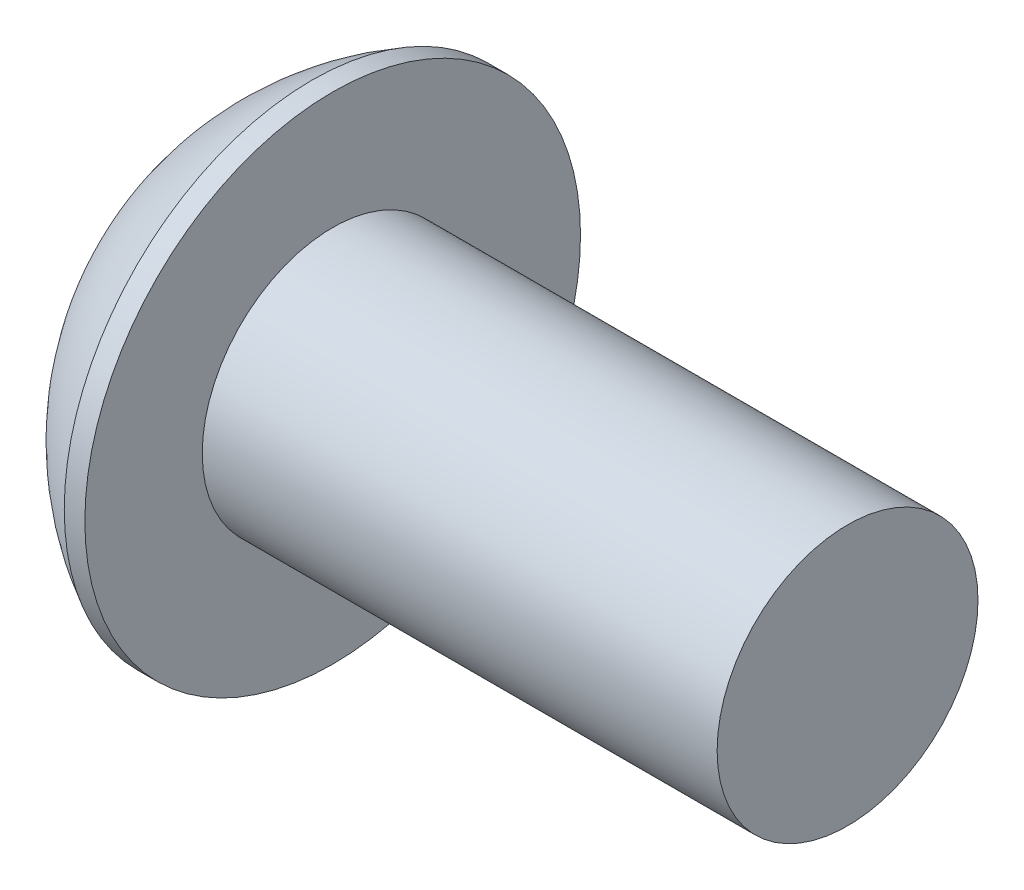
ISO-10303-21;
HEADER;
FILE_DESCRIPTION(('STEP AP214'),'2;1');
FILE_NAME('part.step','',(''),(''),'','','');
FILE_SCHEMA(('AUTOMOTIVE_DESIGN { 1 0 10303 214 1 1 1 1 }'));
ENDSEC;
DATA;
#1=APPLICATION_CONTEXT('core data for automotive mechanical design processes');
#2=APPLICATION_PROTOCOL_DEFINITION('international standard','automotive_design',2000,#1);
#3=PRODUCT_CONTEXT('',#1,'mechanical');
#4=PRODUCT('Part','Part','',(#3));
#5=PRODUCT_RELATED_PRODUCT_CATEGORY('part','',(#4));
#6=PRODUCT_DEFINITION_FORMATION('','',#4);
#7=PRODUCT_DEFINITION_CONTEXT('part definition',#1,'design');
#8=PRODUCT_DEFINITION('design','',#6,#7);
#9=PRODUCT_DEFINITION_SHAPE('','',#8);
#10=(LENGTH_UNIT() NAMED_UNIT(*) SI_UNIT(.MILLI.,.METRE.));
#11=(NAMED_UNIT(*) PLANE_ANGLE_UNIT() SI_UNIT($,.RADIAN.));
#12=(NAMED_UNIT(*) SI_UNIT($,.STERADIAN.) SOLID_ANGLE_UNIT());
#13=UNCERTAINTY_MEASURE_WITH_UNIT(LENGTH_MEASURE(1.E-05),#10,'distance_accuracy_value','');
#14=(GEOMETRIC_REPRESENTATION_CONTEXT(3) GLOBAL_UNCERTAINTY_ASSIGNED_CONTEXT((#13)) GLOBAL_UNIT_ASSIGNED_CONTEXT((#10,
#11,#12)) REPRESENTATION_CONTEXT('',''));
#15=CARTESIAN_POINT('',(0.,0.,0.));
#16=DIRECTION('',(0.,0.,1.));
#17=DIRECTION('',(1.,0.,0.));
#18=AXIS2_PLACEMENT_3D('',#15,#16,#17);
#19=CARTESIAN_POINT('',(-1.82880000000001,0.,0.));
#20=DIRECTION('',(-1.,0.,0.));
#21=DIRECTION('',(0.,0.,-1.));
#22=AXIS2_PLACEMENT_3D('',#19,#20,#21);
#23=CONICAL_SURFACE('',#22,1.8288,0.785398163397446);
#24=CARTESIAN_POINT('',(-1.82880000000001,0.,0.));
#25=DIRECTION('',(1.,0.,0.));
#26=DIRECTION('',(0.,0.,-1.));
#27=AXIS2_PLACEMENT_3D('',#24,#25,#26);
#28=CIRCLE('',#27,1.8288);
#29=CARTESIAN_POINT('',(-1.82880000000001,-1.5800482210968,-0.920845838894232));
#30=VERTEX_POINT('',#29);
#31=CARTESIAN_POINT('',(-1.82880000000001,-0.00745177890319596,-1.82878481812136));
#32=VERTEX_POINT('',#31);
#33=EDGE_CURVE('E237',#30,#32,#28,.T.);
#34=ORIENTED_EDGE('',*,*,#33,.F.);
#35=CARTESIAN_POINT('',(-1.82900000000001,-0.00710296193273566,-1.82898620769315));
#36=CARTESIAN_POINT('',(-1.79798176582111,-0.0612413968680569,-1.79772936770974));
#37=CARTESIAN_POINT('',(-1.768804762154,-0.116280715119974,-1.76595240250098));
#38=CARTESIAN_POINT('',(-1.71541731135211,-0.228486753173014,-1.70117021622636));
#39=CARTESIAN_POINT('',(-1.6912359800132,-0.285663770827651,-1.66815904969199));
#40=CARTESIAN_POINT('',(-1.64983313923053,-0.400953626097391,-1.60159642071718));
#41=CARTESIAN_POINT('',(-1.63250927558265,-0.459038096623038,-1.56806133602346));
#42=CARTESIAN_POINT('',(-1.60583796244815,-0.57646465769773,-1.50026507937697));
#43=CARTESIAN_POINT('',(-1.59647107247955,-0.635803317985223,-1.46600588788664));
#44=CARTESIAN_POINT('',(-1.58800887531627,-0.738427717920978,-1.4067556629583));
#45=CARTESIAN_POINT('',(-1.58678086812113,-0.781586520417756,-1.38183791671889));
#46=CARTESIAN_POINT('',(-1.58902398395721,-0.86782949219464,-1.33204551374779));
#47=CARTESIAN_POINT('',(-1.59249673611106,-0.910913630416431,-1.30717087494764));
#48=CARTESIAN_POINT('',(-1.60394206540771,-0.996659819496217,-1.25766528960044));
#49=CARTESIAN_POINT('',(-1.61191838302761,-1.0393214894606,-1.23303456296242));
#50=CARTESIAN_POINT('',(-1.63193840774461,-1.12392707655171,-1.18418750448042));
#51=CARTESIAN_POINT('',(-1.6439838418413,-1.1658706809649,-1.15997135318168));
#52=CARTESIAN_POINT('',(-1.67924043571692,-1.27185330769289,-1.09878225511085));
#53=CARTESIAN_POINT('',(-1.70494165955475,-1.33527334252756,-1.06216668092704));
#54=CARTESIAN_POINT('',(-1.74825503670668,-1.42856416830639,-1.00830519755071));
#55=CARTESIAN_POINT('',(-1.76346130507454,-1.45931193774139,-0.990552964590434));
#56=CARTESIAN_POINT('',(-1.79524996181871,-1.52025510962339,-0.955367407899095));
#57=CARTESIAN_POINT('',(-1.8118317729839,-1.55045073733563,-0.937933954111084));
#58=CARTESIAN_POINT('',(-1.82900000000027,-1.58039703806773,-0.920644449322172));
#59=B_SPLINE_CURVE_WITH_KNOTS('',3,(#35,#36,#37,#38,#39,#40,#41,#42,#43,#44,#45,#46,#47,#48,#49,
#50,#51,#52,#53,#54,#55,#56,#57,#58),.UNSPECIFIED.,.F.,.F.,(4,2,2,2,2,2,2,2,2,2,2,4),(0.,
0.209500144466995,0.420188843332821,0.627602144749848,0.834507224341981,0.983847288144539,
1.13323912136536,1.28275521623455,1.43233484807212,1.66469982490852,1.78055165650198,
1.89635511741463),.UNSPECIFIED.);
#60=EDGE_CURVE('E207',#32,#30,#59,.T.);
#61=ORIENTED_EDGE('',*,*,#60,.F.);
#62=EDGE_LOOP('',(#34,#61));
#63=FACE_BOUND('',#62,.T.);
#64=ADVANCED_FACE('F43',(#63),#23,.F.);
#65=CARTESIAN_POINT('',(-1.82880000000001,-1.5875,0.907938979227127));
#66=VERTEX_POINT('',#65);
#67=CARTESIAN_POINT('',(-1.82880000000001,-1.5875,-0.907938979227127));
#68=VERTEX_POINT('',#67);
#69=EDGE_CURVE('E270',#66,#68,#28,.T.);
#70=ORIENTED_EDGE('',*,*,#69,.F.);
#71=CARTESIAN_POINT('',(-2.41884583359235,-1.5875,1.82500929221937));
#72=CARTESIAN_POINT('',(-2.38531276542623,-1.5875,1.78055818469936));
#73=CARTESIAN_POINT('',(-2.35210936835997,-1.5875,1.73585907650942));
#74=CARTESIAN_POINT('',(-2.28649794756445,-1.5875,1.64586427633954));
#75=CARTESIAN_POINT('',(-2.25409012601858,-1.5875,1.600568437113));
#76=CARTESIAN_POINT('',(-2.15780190494498,-1.5875,1.46297210215584));
#77=CARTESIAN_POINT('',(-2.09537319757193,-1.5875,1.36963858857972));
#78=CARTESIAN_POINT('',(-1.97284516161749,-1.5875,1.1739408617932));
#79=CARTESIAN_POINT('',(-1.91308014332863,-1.5875,1.07136492019386));
#80=CARTESIAN_POINT('',(-1.80377603992626,-1.5875,0.861093370178889));
#81=CARTESIAN_POINT('',(-1.75420248563308,-1.5875,0.753416586787839));
#82=CARTESIAN_POINT('',(-1.69355473541147,-1.5875,0.59176442890705));
#83=CARTESIAN_POINT('',(-1.67614346878425,-1.5875,0.540176081947481));
#84=CARTESIAN_POINT('',(-1.64546298974417,-1.5875,0.435756532214797));
#85=CARTESIAN_POINT('',(-1.63219406350996,-1.5875,0.382925243842576));
#86=CARTESIAN_POINT('',(-1.61070764570342,-1.5875,0.277216790300937));
#87=CARTESIAN_POINT('',(-1.60240378593419,-1.5875,0.224357458354004));
#88=CARTESIAN_POINT('',(-1.59100915058537,-1.5875,0.118076745851791));
#89=CARTESIAN_POINT('',(-1.58791748493136,-1.5875,0.0646554628277625));
#90=CARTESIAN_POINT('',(-1.58717534074502,-1.5875,-0.0403024254508758));
#91=CARTESIAN_POINT('',(-1.58933324549264,-1.5875,-0.0918377424270171));
#92=CARTESIAN_POINT('',(-1.59854919060368,-1.5875,-0.194465290551352));
#93=CARTESIAN_POINT('',(-1.60560770796995,-1.5875,-0.245557478077194));
#94=CARTESIAN_POINT('',(-1.62435975757509,-1.5875,-0.347793759019247));
#95=CARTESIAN_POINT('',(-1.63613206364932,-1.5875,-0.398923183857681));
#96=CARTESIAN_POINT('',(-1.66368690090293,-1.5875,-0.500065247928145));
#97=CARTESIAN_POINT('',(-1.67946909288466,-1.5875,-0.55007798123241));
#98=CARTESIAN_POINT('',(-1.73513369416259,-1.5875,-0.707672888264434));
#99=CARTESIAN_POINT('',(-1.78136125535134,-1.5875,-0.813008430509164));
#100=CARTESIAN_POINT('',(-1.88413869504212,-1.5875,-1.01872985181378));
#101=CARTESIAN_POINT('',(-1.94072568595621,-1.5875,-1.11909623158763));
#102=CARTESIAN_POINT('',(-2.05746539148359,-1.5875,-1.31090882483437));
#103=CARTESIAN_POINT('',(-2.11730100937777,-1.5875,-1.40255044446812));
#104=CARTESIAN_POINT('',(-2.20979890181475,-1.5875,-1.53756602680819));
#105=CARTESIAN_POINT('',(-2.24095734379018,-1.5875,-1.58198845986807));
#106=CARTESIAN_POINT('',(-2.30409778175578,-1.5875,-1.67022633905771));
#107=CARTESIAN_POINT('',(-2.33607954894282,-1.5875,-1.71404194872823));
#108=CARTESIAN_POINT('',(-2.36840270150048,-1.5875,-1.75760493469799));
#109=B_SPLINE_CURVE_WITH_KNOTS('',3,(#71,#72,#73,#74,#75,#76,#77,#78,#79,#80,#81,#82,#83,#84,
#85,#86,#87,#88,#89,#90,#91,#92,#93,#94,#95,#96,#97,#98,#99,#100,#101,#102,#103,#104,#105,#106,
#107,#108),.UNSPECIFIED.,.F.,.F.,(4,2,2,2,2,2,2,2,2,2,2,2,2,2,2,2,2,2,4),(0.,0.167038582206583,
0.33411918424497,0.670830460170841,1.0266880706705,1.38132155981881,1.54452529826255,
1.70774030934245,1.86802667313751,2.02828566242478,2.18278328824719,2.33729595425851,
2.49450635071892,2.65170345312208,2.99578906555957,3.34113237629954,3.66930816833921,
3.8320834275226,3.99481392942941),.UNSPECIFIED.);
#110=EDGE_CURVE('E216',#68,#66,#109,.F.);
#111=ORIENTED_EDGE('',*,*,#110,.F.);
#112=EDGE_LOOP('',(#70,#111));
#113=FACE_BOUND('',#112,.T.);
#114=ADVANCED_FACE('F282',(#113),#23,.F.);
#115=CARTESIAN_POINT('',(-1.82880000000001,-0.00745177890319589,1.82878481812136));
#116=VERTEX_POINT('',#115);
#117=CARTESIAN_POINT('',(-1.82880000000001,-1.5800482210968,0.920845838894232));
#118=VERTEX_POINT('',#117);
#119=EDGE_CURVE('E263',#116,#118,#28,.T.);
#120=ORIENTED_EDGE('',*,*,#119,.F.);
#121=CARTESIAN_POINT('',(-1.82900000000027,-1.58039703806773,0.920644449322172));
#122=CARTESIAN_POINT('',(-1.79798176582135,-1.52625860313238,0.9519012893056));
#123=CARTESIAN_POINT('',(-1.76880476215421,-1.47121928488044,0.983678254514374));
#124=CARTESIAN_POINT('',(-1.71541731135227,-1.35901324682734,1.04846044078903));
#125=CARTESIAN_POINT('',(-1.69123598001333,-1.30183622917267,1.08147160732341));
#126=CARTESIAN_POINT('',(-1.64983313923061,-1.18654637390287,1.14803423629827));
#127=CARTESIAN_POINT('',(-1.63250927558271,-1.12846190337719,1.181569320992));
#128=CARTESIAN_POINT('',(-1.60583796244818,-1.01103534230243,1.24936557763853));
#129=CARTESIAN_POINT('',(-1.59647107247956,-0.951696682014902,1.28362476912888));
#130=CARTESIAN_POINT('',(-1.58800887531627,-0.849072282079111,1.34287499405724));
#131=CARTESIAN_POINT('',(-1.58678086812113,-0.805913479582331,1.36779274029665));
#132=CARTESIAN_POINT('',(-1.58902398395721,-0.719670507805444,1.41758514326775));
#133=CARTESIAN_POINT('',(-1.59249673611105,-0.676586369583651,1.44245978206791));
#134=CARTESIAN_POINT('',(-1.6039420654077,-0.590840180503862,1.49196536741511));
#135=CARTESIAN_POINT('',(-1.6119183830276,-0.548178510539481,1.51659609405312));
#136=CARTESIAN_POINT('',(-1.63193840774459,-0.463572923448363,1.56544315253513));
#137=CARTESIAN_POINT('',(-1.64398384184128,-0.421629319035169,1.58965930383387));
#138=CARTESIAN_POINT('',(-1.67924043571687,-0.315646692307251,1.65084840190466));
#139=CARTESIAN_POINT('',(-1.70494165955467,-0.252226657472647,1.68746397608843));
#140=CARTESIAN_POINT('',(-1.74825503670653,-0.158935831693913,1.7413254594647));
#141=CARTESIAN_POINT('',(-1.76346130507437,-0.128188062258947,1.75907769242496));
#142=CARTESIAN_POINT('',(-1.79524996181849,-0.0672448903770153,1.79426324911627));
#143=CARTESIAN_POINT('',(-1.81183177298366,-0.0370492626648079,1.81169670290426));
#144=CARTESIAN_POINT('',(-1.82900000000001,-0.00710296193273622,1.82898620769315));
#145=B_SPLINE_CURVE_WITH_KNOTS('',3,(#121,#122,#123,#124,#125,#126,#127,#128,#129,#130,#131,
#132,#133,#134,#135,#136,#137,#138,#139,#140,#141,#142,#143,#144),.UNSPECIFIED.,.F.,.F.,(4,2,2,
2,2,2,2,2,2,2,2,4),(0.,0.209500144467116,0.420188843333066,0.627602144750217,0.834507224342473,
0.983847288145037,1.13323912136586,1.28275521623506,1.43233484807263,1.66469982490877,
1.78055165650211,1.89635511741463),.UNSPECIFIED.);
#146=EDGE_CURVE('E255',#118,#116,#145,.T.);
#147=ORIENTED_EDGE('',*,*,#146,.F.);
#148=EDGE_LOOP('',(#120,#147));
#149=FACE_BOUND('',#148,.T.);
#150=ADVANCED_FACE('F262',(#149),#23,.F.);
#151=CARTESIAN_POINT('',(-1.82880000000001,1.5800482210968,0.920845838894233));
#152=VERTEX_POINT('',#151);
#153=CARTESIAN_POINT('',(-1.82880000000001,0.00745177890319661,1.82878481812136));
#154=VERTEX_POINT('',#153);
#155=EDGE_CURVE('E269',#152,#154,#28,.T.);
#156=ORIENTED_EDGE('',*,*,#155,.F.);
#157=CARTESIAN_POINT('',(-1.82900000000001,0.0071029619327367,1.82898620769315));
#158=CARTESIAN_POINT('',(-1.79798176582111,0.0612413968680578,1.79772936770974));
#159=CARTESIAN_POINT('',(-1.768804762154,0.116280715119975,1.76595240250098));
#160=CARTESIAN_POINT('',(-1.71541731135211,0.228486753173015,1.70117021622636));
#161=CARTESIAN_POINT('',(-1.6912359800132,0.285663770827651,1.66815904969199));
#162=CARTESIAN_POINT('',(-1.64983313923053,0.400953626097391,1.60159642071718));
#163=CARTESIAN_POINT('',(-1.63250927558265,0.459038096623038,1.56806133602346));
#164=CARTESIAN_POINT('',(-1.60583796244815,0.576464657697731,1.50026507937697));
#165=CARTESIAN_POINT('',(-1.59647107247955,0.635803317985223,1.46600588788664));
#166=CARTESIAN_POINT('',(-1.58800887531627,0.738427717920978,1.4067556629583));
#167=CARTESIAN_POINT('',(-1.58678086812113,0.781586520417756,1.38183791671889));
#168=CARTESIAN_POINT('',(-1.58902398395721,0.86782949219464,1.33204551374779));
#169=CARTESIAN_POINT('',(-1.59249673611106,0.910913630416431,1.30717087494764));
#170=CARTESIAN_POINT('',(-1.60394206540771,0.996659819496218,1.25766528960044));
#171=CARTESIAN_POINT('',(-1.61191838302761,1.0393214894606,1.23303456296242));
#172=CARTESIAN_POINT('',(-1.63193840774461,1.12392707655171,1.18418750448042));
#173=CARTESIAN_POINT('',(-1.6439838418413,1.1658706809649,1.15997135318168));
#174=CARTESIAN_POINT('',(-1.67924043571692,1.27185330769289,1.09878225511086));
#175=CARTESIAN_POINT('',(-1.70494165955475,1.33527334252756,1.06216668092704));
#176=CARTESIAN_POINT('',(-1.74825503670668,1.42856416830639,1.00830519755071));
#177=CARTESIAN_POINT('',(-1.76346130507454,1.45931193774139,0.990552964590434));
#178=CARTESIAN_POINT('',(-1.79524996181871,1.52025510962339,0.955367407899095));
#179=CARTESIAN_POINT('',(-1.8118317729839,1.55045073733563,0.937933954111085));
#180=CARTESIAN_POINT('',(-1.82900000000027,1.58039703806773,0.920644449322172));
#181=B_SPLINE_CURVE_WITH_KNOTS('',3,(#157,#158,#159,#160,#161,#162,#163,#164,#165,#166,#167,
#168,#169,#170,#171,#172,#173,#174,#175,#176,#177,#178,#179,#180),.UNSPECIFIED.,.F.,.F.,(4,2,2,
2,2,2,2,2,2,2,2,4),(0.,0.209500144466994,0.420188843332819,0.627602144749847,0.834507224341979,
0.983847288144538,1.13323912136536,1.28275521623455,1.43233484807212,1.66469982490852,
1.78055165650198,1.89635511741463),.UNSPECIFIED.);
#182=EDGE_CURVE('E264',#154,#152,#181,.T.);
#183=ORIENTED_EDGE('',*,*,#182,.F.);
#184=EDGE_LOOP('',(#156,#183));
#185=FACE_BOUND('',#184,.T.);
#186=ADVANCED_FACE('F288',(#185),#23,.F.);
#187=CARTESIAN_POINT('',(-1.82880000000001,1.5875,-0.907938979227128));
#188=VERTEX_POINT('',#187);
#189=CARTESIAN_POINT('',(-1.82880000000001,1.5875,0.907938979227128));
#190=VERTEX_POINT('',#189);
#191=EDGE_CURVE('E242',#188,#190,#28,.T.);
#192=ORIENTED_EDGE('',*,*,#191,.F.);
#193=CARTESIAN_POINT('',(-2.41884583359235,1.5875,1.82500929221937));
#194=CARTESIAN_POINT('',(-2.38531276542623,1.5875,1.78055818469936));
#195=CARTESIAN_POINT('',(-2.35210936835997,1.5875,1.73585907650943));
#196=CARTESIAN_POINT('',(-2.28649794756445,1.5875,1.64586427633954));
#197=CARTESIAN_POINT('',(-2.25409012601858,1.5875,1.600568437113));
#198=CARTESIAN_POINT('',(-2.15780190494498,1.5875,1.46297210215584));
#199=CARTESIAN_POINT('',(-2.09537319757193,1.5875,1.36963858857972));
#200=CARTESIAN_POINT('',(-1.97284516161749,1.5875,1.1739408617932));
#201=CARTESIAN_POINT('',(-1.91308014332863,1.5875,1.07136492019386));
#202=CARTESIAN_POINT('',(-1.80377603992626,1.5875,0.861093370178889));
#203=CARTESIAN_POINT('',(-1.75420248563308,1.5875,0.75341658678784));
#204=CARTESIAN_POINT('',(-1.69355473541147,1.5875,0.591764428907051));
#205=CARTESIAN_POINT('',(-1.67614346878425,1.5875,0.540176081947482));
#206=CARTESIAN_POINT('',(-1.64546298974417,1.5875,0.435756532214797));
#207=CARTESIAN_POINT('',(-1.63219406350996,1.5875,0.382925243842576));
#208=CARTESIAN_POINT('',(-1.61070764570342,1.5875,0.277216790300937));
#209=CARTESIAN_POINT('',(-1.60240378593419,1.5875,0.224357458354004));
#210=CARTESIAN_POINT('',(-1.59100915058537,1.5875,0.118076745851792));
#211=CARTESIAN_POINT('',(-1.58791748493136,1.5875,0.064655462827763));
#212=CARTESIAN_POINT('',(-1.58717534074502,1.5875,-0.0403024254508755));
#213=CARTESIAN_POINT('',(-1.58933324549264,1.5875,-0.091837742427017));
#214=CARTESIAN_POINT('',(-1.59854919060368,1.5875,-0.194465290551352));
#215=CARTESIAN_POINT('',(-1.60560770796995,1.5875,-0.245557478077194));
#216=CARTESIAN_POINT('',(-1.62435975757509,1.5875,-0.347793759019247));
#217=CARTESIAN_POINT('',(-1.63613206364932,1.5875,-0.398923183857681));
#218=CARTESIAN_POINT('',(-1.66368690090293,1.5875,-0.500065247928145));
#219=CARTESIAN_POINT('',(-1.67946909288466,1.5875,-0.55007798123241));
#220=CARTESIAN_POINT('',(-1.73513369416259,1.5875,-0.707672888264434));
#221=CARTESIAN_POINT('',(-1.78136125535134,1.5875,-0.813008430509164));
#222=CARTESIAN_POINT('',(-1.88413869504212,1.5875,-1.01872985181378));
#223=CARTESIAN_POINT('',(-1.94072568595621,1.5875,-1.11909623158763));
#224=CARTESIAN_POINT('',(-2.05746539148359,1.5875,-1.31090882483437));
#225=CARTESIAN_POINT('',(-2.11730100937777,1.5875,-1.40255044446812));
#226=CARTESIAN_POINT('',(-2.20979890181476,1.5875,-1.53756602680819));
#227=CARTESIAN_POINT('',(-2.24095734379018,1.5875,-1.58198845986808));
#228=CARTESIAN_POINT('',(-2.30409778175578,1.5875,-1.67022633905771));
#229=CARTESIAN_POINT('',(-2.33607954894282,1.5875,-1.71404194872824));
#230=CARTESIAN_POINT('',(-2.36840270150048,1.5875,-1.75760493469799));
#231=B_SPLINE_CURVE_WITH_KNOTS('',3,(#193,#194,#195,#196,#197,#198,#199,#200,#201,#202,#203,
#204,#205,#206,#207,#208,#209,#210,#211,#212,#213,#214,#215,#216,#217,#218,#219,#220,#221,#222,
#223,#224,#225,#226,#227,#228,#229,#230),.UNSPECIFIED.,.F.,.F.,(4,2,2,2,2,2,2,2,2,2,2,2,2,2,2,2,
2,2,4),(0.,0.167038582206584,0.334119184244971,0.670830460170842,1.0266880706705,
1.38132155981881,1.54452529826255,1.70774030934245,1.86802667313751,2.02828566242479,
2.18278328824719,2.33729595425851,2.49450635071892,2.65170345312209,2.99578906555957,
3.34113237629955,3.66930816833922,3.8320834275226,3.99481392942941),.UNSPECIFIED.);
#232=EDGE_CURVE('E187',#190,#188,#231,.T.);
#233=ORIENTED_EDGE('',*,*,#232,.F.);
#234=EDGE_LOOP('',(#192,#233));
#235=FACE_BOUND('',#234,.T.);
#236=ADVANCED_FACE('F292',(#235),#23,.F.);
#237=CARTESIAN_POINT('',(-1.82880000000001,0.00745177890319555,-1.82878481812136));
#238=VERTEX_POINT('',#237);
#239=CARTESIAN_POINT('',(-1.82880000000001,1.58004822109681,-0.920845838894231));
#240=VERTEX_POINT('',#239);
#241=EDGE_CURVE('E238',#238,#240,#28,.T.);
#242=ORIENTED_EDGE('',*,*,#241,.F.);
#243=CARTESIAN_POINT('',(-1.82900000000027,1.58039703806773,-0.920644449322171));
#244=CARTESIAN_POINT('',(-1.79798176582135,1.52625860313238,-0.951901289305599));
#245=CARTESIAN_POINT('',(-1.76880476215421,1.47121928488044,-0.983678254514373));
#246=CARTESIAN_POINT('',(-1.71541731135226,1.35901324682734,-1.04846044078903));
#247=CARTESIAN_POINT('',(-1.69123598001333,1.30183622917267,-1.08147160732341));
#248=CARTESIAN_POINT('',(-1.64983313923061,1.18654637390287,-1.14803423629827));
#249=CARTESIAN_POINT('',(-1.63250927558271,1.12846190337719,-1.181569320992));
#250=CARTESIAN_POINT('',(-1.60583796244818,1.01103534230243,-1.24936557763853));
#251=CARTESIAN_POINT('',(-1.59647107247956,0.951696682014902,-1.28362476912888));
#252=CARTESIAN_POINT('',(-1.58800887531627,0.849072282079111,-1.34287499405724));
#253=CARTESIAN_POINT('',(-1.58678086812113,0.805913479582331,-1.36779274029665));
#254=CARTESIAN_POINT('',(-1.58902398395721,0.719670507805444,-1.41758514326775));
#255=CARTESIAN_POINT('',(-1.59249673611105,0.676586369583651,-1.44245978206791));
#256=CARTESIAN_POINT('',(-1.6039420654077,0.590840180503862,-1.49196536741511));
#257=CARTESIAN_POINT('',(-1.6119183830276,0.54817851053948,-1.51659609405312));
#258=CARTESIAN_POINT('',(-1.63193840774459,0.463572923448362,-1.56544315253513));
#259=CARTESIAN_POINT('',(-1.64398384184128,0.421629319035169,-1.58965930383387));
#260=CARTESIAN_POINT('',(-1.67924043571687,0.315646692307251,-1.65084840190466));
#261=CARTESIAN_POINT('',(-1.70494165955467,0.252226657472647,-1.68746397608843));
#262=CARTESIAN_POINT('',(-1.74825503670654,0.158935831693913,-1.7413254594647));
#263=CARTESIAN_POINT('',(-1.76346130507437,0.128188062258947,-1.75907769242496));
#264=CARTESIAN_POINT('',(-1.79524996181849,0.0672448903770154,-1.79426324911627));
#265=CARTESIAN_POINT('',(-1.81183177298366,0.037049262664808,-1.81169670290426));
#266=CARTESIAN_POINT('',(-1.82900000000001,0.00710296193273642,-1.82898620769315));
#267=B_SPLINE_CURVE_WITH_KNOTS('',3,(#243,#244,#245,#246,#247,#248,#249,#250,#251,#252,#253,
#254,#255,#256,#257,#258,#259,#260,#261,#262,#263,#264,#265,#266),.UNSPECIFIED.,.F.,.F.,(4,2,2,
2,2,2,2,2,2,2,2,4),(0.,0.209500144467116,0.420188843333066,0.627602144750217,0.834507224342473,
0.983847288145037,1.13323912136587,1.28275521623506,1.43233484807263,1.66469982490877,
1.78055165650211,1.89635511741463),.UNSPECIFIED.);
#268=EDGE_CURVE('E173',#240,#238,#267,.T.);
#269=ORIENTED_EDGE('',*,*,#268,.F.);
#270=EDGE_LOOP('',(#242,#269));
#271=FACE_BOUND('',#270,.T.);
#272=ADVANCED_FACE('F45',(#271),#23,.F.);
#273=CARTESIAN_POINT('',(-1.82880000000001,2.41299999999999,0.));
#274=DIRECTION('',(1.,0.,0.));
#275=DIRECTION('',(0.,0.,1.));
#276=AXIS2_PLACEMENT_3D('',#273,#274,#275);
#277=PLANE('',#276);
#278=ORIENTED_EDGE('',*,*,#33,.T.);
#279=DIRECTION('',(0.,-0.866025403784439,0.5));
#280=VECTOR('',#279,1.);
#281=CARTESIAN_POINT('',(-1.82880000000001,1.01599999999999,-2.41967497817372));
#282=LINE('',#281,#280);
#283=CARTESIAN_POINT('',(-1.82880000000001,0.,-1.83308710467706));
#284=VERTEX_POINT('',#283);
#285=EDGE_CURVE('E241',#284,#32,#282,.T.);
#286=ORIENTED_EDGE('',*,*,#285,.F.);
#287=DIRECTION('',(0.,0.866025403784438,0.5));
#288=VECTOR('',#287,1.);
#289=CARTESIAN_POINT('',(-1.82880000000001,0.,-1.83308710467706));
#290=LINE('',#289,#288);
#291=EDGE_CURVE('E145',#284,#238,#290,.T.);
#292=ORIENTED_EDGE('',*,*,#291,.T.);
#293=ORIENTED_EDGE('',*,*,#241,.T.);
#294=DIRECTION('',(0.,-0.866025403784438,-0.5));
#295=VECTOR('',#294,1.);
#296=CARTESIAN_POINT('',(-1.82880000000001,2.60349999999999,-0.329955678841873));
#297=LINE('',#296,#295);
#298=CARTESIAN_POINT('',(-1.82880000000001,1.5875,-0.91654355233853));
#299=VERTEX_POINT('',#298);
#300=EDGE_CURVE('E243',#299,#240,#297,.T.);
#301=ORIENTED_EDGE('',*,*,#300,.F.);
#302=DIRECTION('',(0.,0.,1.));
#303=VECTOR('',#302,1.);
#304=CARTESIAN_POINT('',(-1.82880000000001,1.5875,-0.91654355233853));
#305=LINE('',#304,#303);
#306=EDGE_CURVE('E167',#299,#188,#305,.T.);
#307=ORIENTED_EDGE('',*,*,#306,.T.);
#308=ORIENTED_EDGE('',*,*,#191,.T.);
#309=DIRECTION('',(0.,0.,-1.));
#310=VECTOR('',#309,1.);
#311=CARTESIAN_POINT('',(-1.82880000000001,1.5875,0.));
#312=LINE('',#311,#310);
#313=CARTESIAN_POINT('',(-1.82880000000001,1.5875,0.916543552338531));
#314=VERTEX_POINT('',#313);
#315=EDGE_CURVE('E245',#314,#190,#312,.T.);
#316=ORIENTED_EDGE('',*,*,#315,.F.);
#317=DIRECTION('',(0.,-0.866025403784438,0.5));
#318=VECTOR('',#317,1.);
#319=CARTESIAN_POINT('',(-1.82880000000001,1.5875,0.916543552338531));
#320=LINE('',#319,#318);
#321=EDGE_CURVE('E169',#314,#152,#320,.T.);
#322=ORIENTED_EDGE('',*,*,#321,.T.);
#323=ORIENTED_EDGE('',*,*,#155,.T.);
#324=DIRECTION('',(0.,0.866025403784439,-0.5));
#325=VECTOR('',#324,1.);
#326=CARTESIAN_POINT('',(-1.82880000000001,2.60349999999999,0.329955678841874));
#327=LINE('',#326,#325);
#328=CARTESIAN_POINT('',(-1.82880000000001,0.,1.83308710467706));
#329=VERTEX_POINT('',#328);
#330=EDGE_CURVE('E248',#329,#154,#327,.T.);
#331=ORIENTED_EDGE('',*,*,#330,.F.);
#332=DIRECTION('',(0.,-0.866025403784438,-0.5));
#333=VECTOR('',#332,1.);
#334=CARTESIAN_POINT('',(-1.82880000000001,0.,1.83308710467706));
#335=LINE('',#334,#333);
#336=EDGE_CURVE('E155',#329,#116,#335,.T.);
#337=ORIENTED_EDGE('',*,*,#336,.T.);
#338=ORIENTED_EDGE('',*,*,#119,.T.);
#339=DIRECTION('',(0.,0.866025403784439,0.5));
#340=VECTOR('',#339,1.);
#341=CARTESIAN_POINT('',(-1.82880000000001,1.01599999999999,2.41967497817372));
#342=LINE('',#341,#340);
#343=CARTESIAN_POINT('',(-1.82880000000001,-1.5875,0.91654355233853));
#344=VERTEX_POINT('',#343);
#345=EDGE_CURVE('E52',#344,#118,#342,.T.);
#346=ORIENTED_EDGE('',*,*,#345,.F.);
#347=DIRECTION('',(0.,0.,-1.));
#348=VECTOR('',#347,1.);
#349=CARTESIAN_POINT('',(-1.82880000000001,-1.5875,0.91654355233853));
#350=LINE('',#349,#348);
#351=EDGE_CURVE('E153',#344,#66,#350,.T.);
#352=ORIENTED_EDGE('',*,*,#351,.T.);
#353=ORIENTED_EDGE('',*,*,#69,.T.);
#354=DIRECTION('',(0.,0.,1.));
#355=VECTOR('',#354,1.);
#356=CARTESIAN_POINT('',(-1.82880000000001,-1.5875,0.));
#357=LINE('',#356,#355);
#358=CARTESIAN_POINT('',(-1.82880000000001,-1.5875,-0.916543552338531));
#359=VERTEX_POINT('',#358);
#360=EDGE_CURVE('E11',#359,#68,#357,.T.);
#361=ORIENTED_EDGE('',*,*,#360,.F.);
#362=DIRECTION('',(0.,0.866025403784438,-0.5));
#363=VECTOR('',#362,1.);
#364=CARTESIAN_POINT('',(-1.82880000000001,-1.5875,-0.916543552338531));
#365=LINE('',#364,#363);
#366=EDGE_CURVE('E164',#359,#30,#365,.T.);
#367=ORIENTED_EDGE('',*,*,#366,.T.);
#368=EDGE_LOOP('',(#278,#286,#292,#293,#301,#307,#308,#316,#322,#323,#331,#337,#338,#346,#352,
#353,#361,#367));
#369=FACE_BOUND('',#368,.T.);
#370=CARTESIAN_POINT('',(-1.82880000000001,0.,0.));
#371=DIRECTION('',(1.,0.,0.));
#372=DIRECTION('',(0.,0.,-1.));
#373=AXIS2_PLACEMENT_3D('',#370,#371,#372);
#374=CIRCLE('',#373,2.41299999999999);
#375=CARTESIAN_POINT('',(-1.82880000000001,0.,-2.41299999999999));
#376=VERTEX_POINT('',#375);
#377=EDGE_CURVE('E234',#376,#376,#374,.T.);
#378=ORIENTED_EDGE('',*,*,#377,.F.);
#379=EDGE_LOOP('',(#378));
#380=FACE_BOUND('',#379,.T.);
#381=ADVANCED_FACE('F266',(#369,#380),#277,.F.);
#382=CARTESIAN_POINT('',(2.75154317616326,0.,0.));
#383=DIRECTION('',(-1.,0.,0.));
#384=DIRECTION('',(0.,0.,-1.));
#385=AXIS2_PLACEMENT_3D('',#382,#383,#384);
#386=DEGENERATE_TOROIDAL_SURFACE('',#385,0.00969167426947537,5.1816,.F.);
#387=ORIENTED_EDGE('',*,*,#377,.T.);
#388=EDGE_LOOP('',(#387));
#389=FACE_BOUND('',#388,.T.);
#390=CARTESIAN_POINT('',(0.355599999999993,0.,0.));
#391=DIRECTION('',(1.,0.,0.));
#392=DIRECTION('',(0.,0.,-1.));
#393=AXIS2_PLACEMENT_3D('',#390,#391,#392);
#394=CIRCLE('',#393,4.5847);
#395=CARTESIAN_POINT('',(0.355599999999993,0.,-4.5847));
#396=VERTEX_POINT('',#395);
#397=EDGE_CURVE('E231',#396,#396,#394,.T.);
#398=ORIENTED_EDGE('',*,*,#397,.F.);
#399=EDGE_LOOP('',(#398));
#400=FACE_BOUND('',#399,.T.);
#401=ADVANCED_FACE('F298',(#389,#400),#386,.F.);
#402=CARTESIAN_POINT('',(0.,0.,0.));
#403=DIRECTION('',(-1.,0.,0.));
#404=DIRECTION('',(0.,0.,-1.));
#405=AXIS2_PLACEMENT_3D('',#402,#403,#404);
#406=CYLINDRICAL_SURFACE('',#405,4.5847);
#407=ORIENTED_EDGE('',*,*,#397,.T.);
#408=EDGE_LOOP('',(#407));
#409=FACE_BOUND('',#408,.T.);
#410=CARTESIAN_POINT('',(0.736599999999993,0.,0.));
#411=DIRECTION('',(1.,0.,0.));
#412=DIRECTION('',(0.,0.,-1.));
#413=AXIS2_PLACEMENT_3D('',#410,#411,#412);
#414=CIRCLE('',#413,4.5847);
#415=CARTESIAN_POINT('',(0.736599999999993,0.,-4.5847));
#416=VERTEX_POINT('',#415);
#417=EDGE_CURVE('E228',#416,#416,#414,.T.);
#418=ORIENTED_EDGE('',*,*,#417,.F.);
#419=EDGE_LOOP('',(#418));
#420=FACE_BOUND('',#419,.T.);
#421=ADVANCED_FACE('F380',(#409,#420),#406,.T.);
#422=CARTESIAN_POINT('',(0.736599999999992,2.41299999999999,0.));
#423=DIRECTION('',(-1.,0.,0.));
#424=DIRECTION('',(0.,0.,-1.));
#425=AXIS2_PLACEMENT_3D('',#422,#423,#424);
#426=PLANE('',#425);
#427=ORIENTED_EDGE('',*,*,#417,.T.);
#428=EDGE_LOOP('',(#427));
#429=FACE_BOUND('',#428,.T.);
#430=CARTESIAN_POINT('',(0.73659999999999,0.,0.));
#431=DIRECTION('',(1.,0.,0.));
#432=DIRECTION('',(0.,0.,-1.));
#433=AXIS2_PLACEMENT_3D('',#430,#431,#432);
#434=CIRCLE('',#433,2.41299999999999);
#435=CARTESIAN_POINT('',(0.73659999999999,0.,-2.41299999999999));
#436=VERTEX_POINT('',#435);
#437=EDGE_CURVE('E225',#436,#436,#434,.T.);
#438=ORIENTED_EDGE('',*,*,#437,.F.);
#439=EDGE_LOOP('',(#438));
#440=FACE_BOUND('',#439,.T.);
#441=ADVANCED_FACE('F374',(#429,#440),#426,.F.);
#442=CARTESIAN_POINT('',(0.,0.,0.));
#443=DIRECTION('',(-1.,0.,0.));
#444=DIRECTION('',(0.,0.,-1.));
#445=AXIS2_PLACEMENT_3D('',#442,#443,#444);
#446=CYLINDRICAL_SURFACE('',#445,2.413);
#447=ORIENTED_EDGE('',*,*,#437,.T.);
#448=EDGE_LOOP('',(#447));
#449=FACE_BOUND('',#448,.T.);
#450=CARTESIAN_POINT('',(10.2616,0.,0.));
#451=DIRECTION('',(1.,0.,0.));
#452=DIRECTION('',(0.,0.,-1.));
#453=AXIS2_PLACEMENT_3D('',#450,#451,#452);
#454=CIRCLE('',#453,2.413);
#455=CARTESIAN_POINT('',(10.2616,0.,-2.413));
#456=VERTEX_POINT('',#455);
#457=EDGE_CURVE('E215',#456,#456,#454,.T.);
#458=ORIENTED_EDGE('',*,*,#457,.F.);
#459=EDGE_LOOP('',(#458));
#460=FACE_BOUND('',#459,.T.);
#461=ADVANCED_FACE('F366',(#449,#460),#446,.T.);
#462=CARTESIAN_POINT('',(10.2616,0.,0.));
#463=DIRECTION('',(-1.,0.,0.));
#464=DIRECTION('',(0.,0.,-1.));
#465=AXIS2_PLACEMENT_3D('',#462,#463,#464);
#466=PLANE('',#465);
#467=ORIENTED_EDGE('',*,*,#457,.T.);
#468=EDGE_LOOP('',(#467));
#469=FACE_BOUND('',#468,.T.);
#470=ADVANCED_FACE('F204',(#469),#466,.F.);
#471=CARTESIAN_POINT('',(0.,-1.5875,-0.916543552338531));
#472=DIRECTION('',(0.,-0.5,-0.866025403784439));
#473=DIRECTION('',(0.,-0.866025403784439,0.5));
#474=AXIS2_PLACEMENT_3D('',#471,#472,#473);
#475=PLANE('',#474);
#476=ORIENTED_EDGE('',*,*,#285,.T.);
#477=ORIENTED_EDGE('',*,*,#60,.T.);
#478=ORIENTED_EDGE('',*,*,#366,.F.);
#479=DIRECTION('',(-1.,0.,0.));
#480=VECTOR('',#479,1.);
#481=CARTESIAN_POINT('',(0.,-1.5875,-0.916543552338531));
#482=LINE('',#481,#480);
#483=CARTESIAN_POINT('',(0.,-1.5875,-0.916543552338531));
#484=VERTEX_POINT('',#483);
#485=EDGE_CURVE('E152',#484,#359,#482,.T.);
#486=ORIENTED_EDGE('',*,*,#485,.F.);
#487=DIRECTION('',(0.,0.866025403784438,-0.5));
#488=VECTOR('',#487,1.);
#489=CARTESIAN_POINT('',(0.,-1.5875,-0.916543552338531));
#490=LINE('',#489,#488);
#491=CARTESIAN_POINT('',(0.,0.,-1.83308710467706));
#492=VERTEX_POINT('',#491);
#493=EDGE_CURVE('E136',#484,#492,#490,.T.);
#494=ORIENTED_EDGE('',*,*,#493,.T.);
#495=DIRECTION('',(-1.,0.,0.));
#496=VECTOR('',#495,1.);
#497=CARTESIAN_POINT('',(0.,0.,-1.83308710467706));
#498=LINE('',#497,#496);
#499=EDGE_CURVE('E59',#492,#284,#498,.T.);
#500=ORIENTED_EDGE('',*,*,#499,.T.);
#501=EDGE_LOOP('',(#476,#477,#478,#486,#494,#500));
#502=FACE_BOUND('',#501,.T.);
#503=ADVANCED_FACE('F150',(#502),#475,.F.);
#504=CARTESIAN_POINT('',(0.,-1.5875,0.91654355233853));
#505=DIRECTION('',(0.,-1.,0.));
#506=DIRECTION('',(0.,0.,1.));
#507=AXIS2_PLACEMENT_3D('',#504,#505,#506);
#508=PLANE('',#507);
#509=ORIENTED_EDGE('',*,*,#360,.T.);
#510=ORIENTED_EDGE('',*,*,#110,.T.);
#511=ORIENTED_EDGE('',*,*,#351,.F.);
#512=DIRECTION('',(-1.,0.,0.));
#513=VECTOR('',#512,1.);
#514=CARTESIAN_POINT('',(0.,-1.5875,0.91654355233853));
#515=LINE('',#514,#513);
#516=CARTESIAN_POINT('',(0.,-1.5875,0.91654355233853));
#517=VERTEX_POINT('',#516);
#518=EDGE_CURVE('E174',#517,#344,#515,.T.);
#519=ORIENTED_EDGE('',*,*,#518,.F.);
#520=DIRECTION('',(0.,0.,-1.));
#521=VECTOR('',#520,1.);
#522=CARTESIAN_POINT('',(0.,-1.5875,0.91654355233853));
#523=LINE('',#522,#521);
#524=EDGE_CURVE('E148',#517,#484,#523,.T.);
#525=ORIENTED_EDGE('',*,*,#524,.T.);
#526=ORIENTED_EDGE('',*,*,#485,.T.);
#527=EDGE_LOOP('',(#509,#510,#511,#519,#525,#526));
#528=FACE_BOUND('',#527,.T.);
#529=ADVANCED_FACE('F203',(#528),#508,.F.);
#530=CARTESIAN_POINT('',(0.,0.,1.83308710467706));
#531=DIRECTION('',(0.,-0.5,0.866025403784438));
#532=DIRECTION('',(0.,0.866025403784439,0.5));
#533=AXIS2_PLACEMENT_3D('',#530,#531,#532);
#534=PLANE('',#533);
#535=ORIENTED_EDGE('',*,*,#345,.T.);
#536=ORIENTED_EDGE('',*,*,#146,.T.);
#537=ORIENTED_EDGE('',*,*,#336,.F.);
#538=DIRECTION('',(-1.,0.,0.));
#539=VECTOR('',#538,1.);
#540=CARTESIAN_POINT('',(0.,0.,1.83308710467706));
#541=LINE('',#540,#539);
#542=CARTESIAN_POINT('',(0.,0.,1.83308710467706));
#543=VERTEX_POINT('',#542);
#544=EDGE_CURVE('E176',#543,#329,#541,.T.);
#545=ORIENTED_EDGE('',*,*,#544,.F.);
#546=DIRECTION('',(0.,-0.866025403784438,-0.5));
#547=VECTOR('',#546,1.);
#548=CARTESIAN_POINT('',(0.,0.,1.83308710467706));
#549=LINE('',#548,#547);
#550=EDGE_CURVE('E161',#543,#517,#549,.T.);
#551=ORIENTED_EDGE('',*,*,#550,.T.);
#552=ORIENTED_EDGE('',*,*,#518,.T.);
#553=EDGE_LOOP('',(#535,#536,#537,#545,#551,#552));
#554=FACE_BOUND('',#553,.T.);
#555=ADVANCED_FACE('F253',(#554),#534,.F.);
#556=CARTESIAN_POINT('',(0.,1.5875,0.916543552338531));
#557=DIRECTION('',(0.,0.5,0.866025403784438));
#558=DIRECTION('',(0.,0.866025403784439,-0.5));
#559=AXIS2_PLACEMENT_3D('',#556,#557,#558);
#560=PLANE('',#559);
#561=ORIENTED_EDGE('',*,*,#330,.T.);
#562=ORIENTED_EDGE('',*,*,#182,.T.);
#563=ORIENTED_EDGE('',*,*,#321,.F.);
#564=DIRECTION('',(-1.,0.,0.));
#565=VECTOR('',#564,1.);
#566=CARTESIAN_POINT('',(0.,1.5875,0.916543552338531));
#567=LINE('',#566,#565);
#568=CARTESIAN_POINT('',(0.,1.5875,0.916543552338531));
#569=VERTEX_POINT('',#568);
#570=EDGE_CURVE('E178',#569,#314,#567,.T.);
#571=ORIENTED_EDGE('',*,*,#570,.F.);
#572=DIRECTION('',(0.,-0.866025403784438,0.5));
#573=VECTOR('',#572,1.);
#574=CARTESIAN_POINT('',(0.,1.5875,0.916543552338531));
#575=LINE('',#574,#573);
#576=EDGE_CURVE('E159',#569,#543,#575,.T.);
#577=ORIENTED_EDGE('',*,*,#576,.T.);
#578=ORIENTED_EDGE('',*,*,#544,.T.);
#579=EDGE_LOOP('',(#561,#562,#563,#571,#577,#578));
#580=FACE_BOUND('',#579,.T.);
#581=ADVANCED_FACE('F324',(#580),#560,.F.);
#582=CARTESIAN_POINT('',(0.,1.5875,-0.91654355233853));
#583=DIRECTION('',(0.,1.,0.));
#584=DIRECTION('',(0.,0.,-1.));
#585=AXIS2_PLACEMENT_3D('',#582,#583,#584);
#586=PLANE('',#585);
#587=ORIENTED_EDGE('',*,*,#315,.T.);
#588=ORIENTED_EDGE('',*,*,#232,.T.);
#589=ORIENTED_EDGE('',*,*,#306,.F.);
#590=DIRECTION('',(-1.,0.,0.));
#591=VECTOR('',#590,1.);
#592=CARTESIAN_POINT('',(0.,1.5875,-0.91654355233853));
#593=LINE('',#592,#591);
#594=CARTESIAN_POINT('',(0.,1.5875,-0.91654355233853));
#595=VERTEX_POINT('',#594);
#596=EDGE_CURVE('E147',#595,#299,#593,.T.);
#597=ORIENTED_EDGE('',*,*,#596,.F.);
#598=DIRECTION('',(0.,0.,1.));
#599=VECTOR('',#598,1.);
#600=CARTESIAN_POINT('',(0.,1.5875,-0.91654355233853));
#601=LINE('',#600,#599);
#602=EDGE_CURVE('E139',#595,#569,#601,.T.);
#603=ORIENTED_EDGE('',*,*,#602,.T.);
#604=ORIENTED_EDGE('',*,*,#570,.T.);
#605=EDGE_LOOP('',(#587,#588,#589,#597,#603,#604));
#606=FACE_BOUND('',#605,.T.);
#607=ADVANCED_FACE('F197',(#606),#586,.F.);
#608=CARTESIAN_POINT('',(0.,0.,-1.83308710467706));
#609=DIRECTION('',(0.,0.5,-0.866025403784438));
#610=DIRECTION('',(0.,-0.866025403784438,-0.5));
#611=AXIS2_PLACEMENT_3D('',#608,#609,#610);
#612=PLANE('',#611);
#613=ORIENTED_EDGE('',*,*,#300,.T.);
#614=ORIENTED_EDGE('',*,*,#268,.T.);
#615=ORIENTED_EDGE('',*,*,#291,.F.);
#616=ORIENTED_EDGE('',*,*,#499,.F.);
#617=DIRECTION('',(0.,0.866025403784438,0.5));
#618=VECTOR('',#617,1.);
#619=CARTESIAN_POINT('',(0.,0.,-1.83308710467706));
#620=LINE('',#619,#618);
#621=EDGE_CURVE('E133',#492,#595,#620,.T.);
#622=ORIENTED_EDGE('',*,*,#621,.T.);
#623=ORIENTED_EDGE('',*,*,#596,.T.);
#624=EDGE_LOOP('',(#613,#614,#615,#616,#622,#623));
#625=FACE_BOUND('',#624,.T.);
#626=ADVANCED_FACE('F143',(#625),#612,.F.);
#627=CARTESIAN_POINT('',(0.,0.,0.));
#628=DIRECTION('',(-1.,0.,0.));
#629=DIRECTION('',(0.,0.,-1.));
#630=AXIS2_PLACEMENT_3D('',#627,#628,#629);
#631=PLANE('',#630);
#632=CARTESIAN_POINT('',(0.,0.,0.));
#633=VERTEX_POINT('',#632);
#634=VERTEX_LOOP('',#633);
#635=FACE_BOUND('',#634,.T.);
#636=ORIENTED_EDGE('',*,*,#493,.F.);
#637=ORIENTED_EDGE('',*,*,#524,.F.);
#638=ORIENTED_EDGE('',*,*,#550,.F.);
#639=ORIENTED_EDGE('',*,*,#576,.F.);
#640=ORIENTED_EDGE('',*,*,#602,.F.);
#641=ORIENTED_EDGE('',*,*,#621,.F.);
#642=EDGE_LOOP('',(#636,#637,#638,#639,#640,#641));
#643=FACE_BOUND('',#642,.T.);
#644=ADVANCED_FACE('F134',(#635,#643),#631,.T.);
#645=CLOSED_SHELL('',(#64,#114,#150,#186,#236,#272,#381,#401,#421,#441,#461,#470,#503,#529,#555,
#581,#607,#626,#644));
#646=MANIFOLD_SOLID_BREP('B2',#645);
#647=ADVANCED_BREP_SHAPE_REPRESENTATION('',(#18,#646),#14);
#648=SHAPE_DEFINITION_REPRESENTATION(#9,#647);
ENDSEC;
END-ISO-10303-21;
